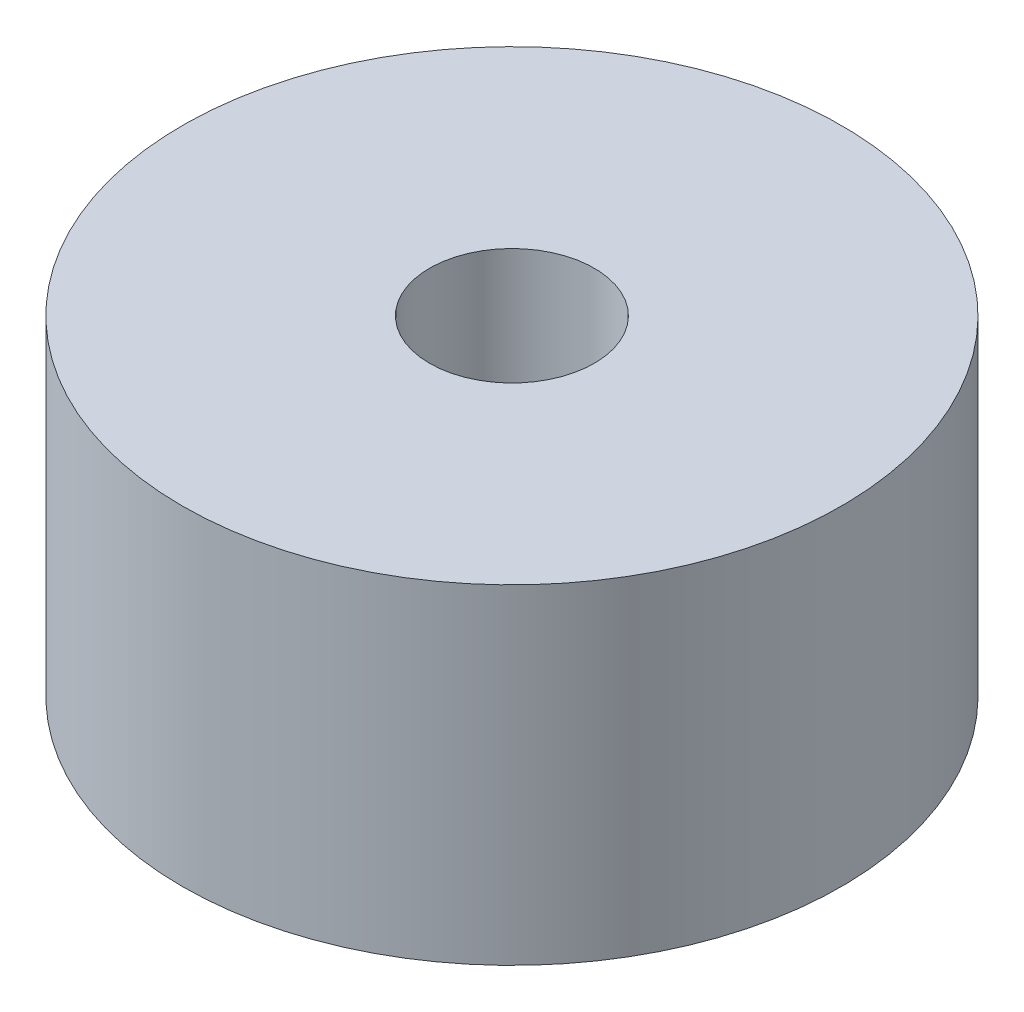
ISO-10303-21;
HEADER;
FILE_DESCRIPTION(('STEP AP214'),'2;1');
FILE_NAME('part.step','',(''),(''),'','','');
FILE_SCHEMA(('AUTOMOTIVE_DESIGN { 1 0 10303 214 1 1 1 1 }'));
ENDSEC;
DATA;
#1=APPLICATION_CONTEXT('core data for automotive mechanical design processes');
#2=APPLICATION_PROTOCOL_DEFINITION('international standard','automotive_design',2000,#1);
#3=PRODUCT_CONTEXT('',#1,'mechanical');
#4=PRODUCT('Part','Part','',(#3));
#5=PRODUCT_RELATED_PRODUCT_CATEGORY('part','',(#4));
#6=PRODUCT_DEFINITION_FORMATION('','',#4);
#7=PRODUCT_DEFINITION_CONTEXT('part definition',#1,'design');
#8=PRODUCT_DEFINITION('design','',#6,#7);
#9=PRODUCT_DEFINITION_SHAPE('','',#8);
#10=(LENGTH_UNIT() NAMED_UNIT(*) SI_UNIT(.MILLI.,.METRE.));
#11=(NAMED_UNIT(*) PLANE_ANGLE_UNIT() SI_UNIT($,.RADIAN.));
#12=(NAMED_UNIT(*) SI_UNIT($,.STERADIAN.) SOLID_ANGLE_UNIT());
#13=UNCERTAINTY_MEASURE_WITH_UNIT(LENGTH_MEASURE(1.E-05),#10,'distance_accuracy_value','');
#14=(GEOMETRIC_REPRESENTATION_CONTEXT(3) GLOBAL_UNCERTAINTY_ASSIGNED_CONTEXT((#13)) GLOBAL_UNIT_ASSIGNED_CONTEXT((#10,
#11,#12)) REPRESENTATION_CONTEXT('',''));
#15=CARTESIAN_POINT('',(0.,0.,0.));
#16=DIRECTION('',(0.,0.,1.));
#17=DIRECTION('',(1.,0.,0.));
#18=AXIS2_PLACEMENT_3D('',#15,#16,#17);
#19=CARTESIAN_POINT('',(0.,12.7,0.));
#20=DIRECTION('',(0.,1.,0.));
#21=DIRECTION('',(0.,0.,1.));
#22=AXIS2_PLACEMENT_3D('',#19,#20,#21);
#23=PLANE('',#22);
#24=CARTESIAN_POINT('',(0.,12.7,0.));
#25=DIRECTION('',(0.,1.,0.));
#26=DIRECTION('',(0.,0.,1.));
#27=AXIS2_PLACEMENT_3D('',#24,#25,#26);
#28=CIRCLE('',#27,12.7);
#29=CARTESIAN_POINT('',(0.,12.7,12.7));
#30=VERTEX_POINT('',#29);
#31=EDGE_CURVE('E10',#30,#30,#28,.T.);
#32=ORIENTED_EDGE('',*,*,#31,.T.);
#33=EDGE_LOOP('',(#32));
#34=FACE_BOUND('',#33,.T.);
#35=CARTESIAN_POINT('',(0.,12.7,0.));
#36=DIRECTION('',(0.,1.,0.));
#37=DIRECTION('',(0.,0.,1.));
#38=AXIS2_PLACEMENT_3D('',#35,#36,#37);
#39=CIRCLE('',#38,3.175);
#40=CARTESIAN_POINT('',(0.,12.7,3.175));
#41=VERTEX_POINT('',#40);
#42=EDGE_CURVE('E54',#41,#41,#39,.T.);
#43=ORIENTED_EDGE('',*,*,#42,.F.);
#44=EDGE_LOOP('',(#43));
#45=FACE_BOUND('',#44,.T.);
#46=ADVANCED_FACE('F41',(#34,#45),#23,.T.);
#47=CARTESIAN_POINT('',(0.,0.,0.));
#48=DIRECTION('',(0.,1.,0.));
#49=DIRECTION('',(0.,0.,1.));
#50=AXIS2_PLACEMENT_3D('',#47,#48,#49);
#51=PLANE('',#50);
#52=CARTESIAN_POINT('',(0.,0.,0.));
#53=DIRECTION('',(0.,1.,0.));
#54=DIRECTION('',(0.,0.,1.));
#55=AXIS2_PLACEMENT_3D('',#52,#53,#54);
#56=CIRCLE('',#55,12.7);
#57=CARTESIAN_POINT('',(0.,0.,12.7));
#58=VERTEX_POINT('',#57);
#59=EDGE_CURVE('E45',#58,#58,#56,.T.);
#60=ORIENTED_EDGE('',*,*,#59,.F.);
#61=EDGE_LOOP('',(#60));
#62=FACE_BOUND('',#61,.T.);
#63=CARTESIAN_POINT('',(0.,0.,0.));
#64=DIRECTION('',(0.,1.,0.));
#65=DIRECTION('',(0.,0.,1.));
#66=AXIS2_PLACEMENT_3D('',#63,#64,#65);
#67=CIRCLE('',#66,3.175);
#68=CARTESIAN_POINT('',(0.,0.,3.175));
#69=VERTEX_POINT('',#68);
#70=EDGE_CURVE('E56',#69,#69,#67,.T.);
#71=ORIENTED_EDGE('',*,*,#70,.T.);
#72=EDGE_LOOP('',(#71));
#73=FACE_BOUND('',#72,.T.);
#74=ADVANCED_FACE('F68',(#62,#73),#51,.F.);
#75=CARTESIAN_POINT('',(0.,12.7,0.));
#76=DIRECTION('',(0.,-1.,0.));
#77=DIRECTION('',(0.,0.,-1.));
#78=AXIS2_PLACEMENT_3D('',#75,#76,#77);
#79=CYLINDRICAL_SURFACE('',#78,12.7);
#80=ORIENTED_EDGE('',*,*,#31,.F.);
#81=EDGE_LOOP('',(#80));
#82=FACE_BOUND('',#81,.T.);
#83=ORIENTED_EDGE('',*,*,#59,.T.);
#84=EDGE_LOOP('',(#83));
#85=FACE_BOUND('',#84,.T.);
#86=ADVANCED_FACE('F43',(#82,#85),#79,.T.);
#87=CARTESIAN_POINT('',(0.,12.7,0.));
#88=DIRECTION('',(0.,-1.,0.));
#89=DIRECTION('',(0.,0.,-1.));
#90=AXIS2_PLACEMENT_3D('',#87,#88,#89);
#91=CYLINDRICAL_SURFACE('',#90,3.175);
#92=ORIENTED_EDGE('',*,*,#42,.T.);
#93=EDGE_LOOP('',(#92));
#94=FACE_BOUND('',#93,.T.);
#95=ORIENTED_EDGE('',*,*,#70,.F.);
#96=EDGE_LOOP('',(#95));
#97=FACE_BOUND('',#96,.T.);
#98=ADVANCED_FACE('F64',(#94,#97),#91,.F.);
#99=CLOSED_SHELL('',(#46,#74,#86,#98));
#100=MANIFOLD_SOLID_BREP('B2',#99);
#101=ADVANCED_BREP_SHAPE_REPRESENTATION('',(#18,#100),#14);
#102=SHAPE_DEFINITION_REPRESENTATION(#9,#101);
ENDSEC;
END-ISO-10303-21;
